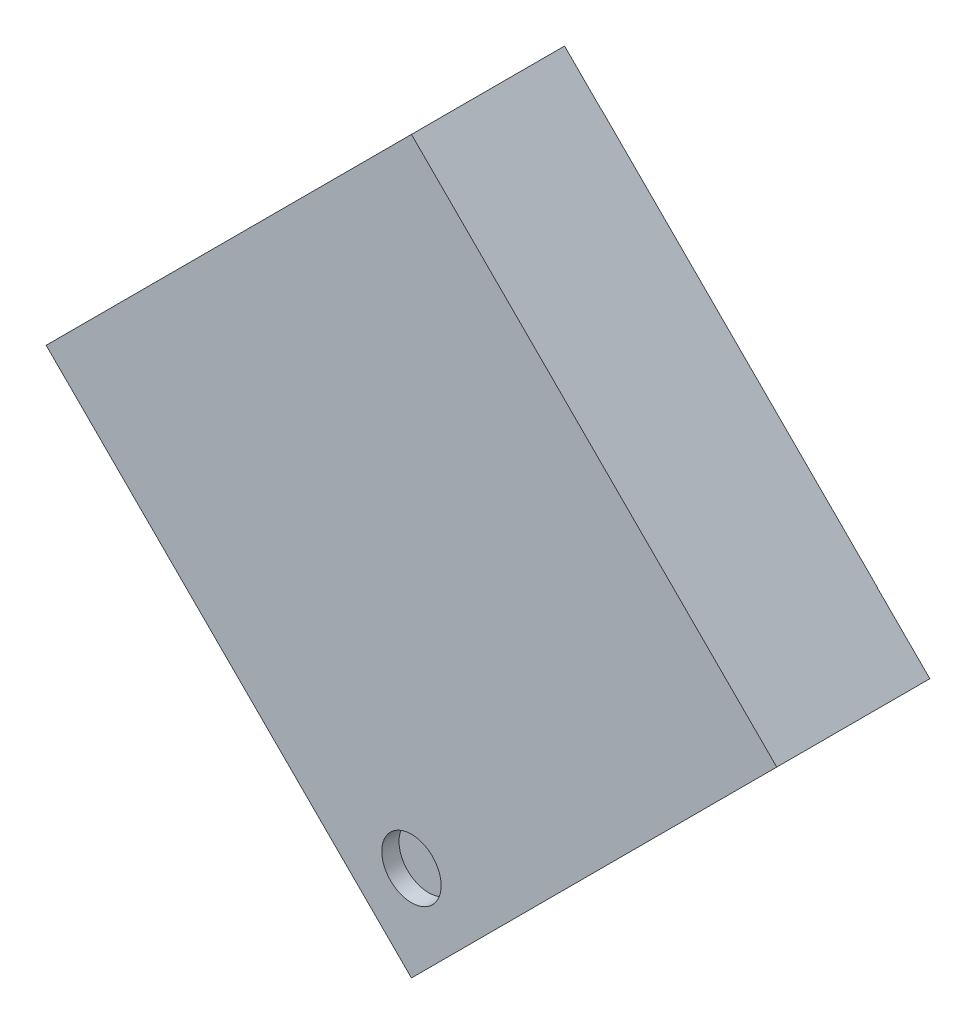
ISO-10303-21;
HEADER;
FILE_DESCRIPTION(('STEP AP214'),'2;1');
FILE_NAME('part.step','',(''),(''),'','','');
FILE_SCHEMA(('AUTOMOTIVE_DESIGN { 1 0 10303 214 1 1 1 1 }'));
ENDSEC;
DATA;
#1=APPLICATION_CONTEXT('core data for automotive mechanical design processes');
#2=APPLICATION_PROTOCOL_DEFINITION('international standard','automotive_design',2000,#1);
#3=PRODUCT_CONTEXT('',#1,'mechanical');
#4=PRODUCT('Part','Part','',(#3));
#5=PRODUCT_RELATED_PRODUCT_CATEGORY('part','',(#4));
#6=PRODUCT_DEFINITION_FORMATION('','',#4);
#7=PRODUCT_DEFINITION_CONTEXT('part definition',#1,'design');
#8=PRODUCT_DEFINITION('design','',#6,#7);
#9=PRODUCT_DEFINITION_SHAPE('','',#8);
#10=(LENGTH_UNIT() NAMED_UNIT(*) SI_UNIT(.MILLI.,.METRE.));
#11=(NAMED_UNIT(*) PLANE_ANGLE_UNIT() SI_UNIT($,.RADIAN.));
#12=(NAMED_UNIT(*) SI_UNIT($,.STERADIAN.) SOLID_ANGLE_UNIT());
#13=UNCERTAINTY_MEASURE_WITH_UNIT(LENGTH_MEASURE(1.E-05),#10,'distance_accuracy_value','');
#14=(GEOMETRIC_REPRESENTATION_CONTEXT(3) GLOBAL_UNCERTAINTY_ASSIGNED_CONTEXT((#13)) GLOBAL_UNIT_ASSIGNED_CONTEXT((#10,
#11,#12)) REPRESENTATION_CONTEXT('',''));
#15=CARTESIAN_POINT('',(0.,0.,0.));
#16=DIRECTION('',(0.,0.,1.));
#17=DIRECTION('',(1.,0.,0.));
#18=AXIS2_PLACEMENT_3D('',#15,#16,#17);
#19=CARTESIAN_POINT('',(0.000121919998491649,4.06399994972162E-05,0.0121919997036457));
#20=DIRECTION('',(0.,-4.37113882867379E-08,0.999999999999999));
#21=DIRECTION('',(1.,0.,0.));
#22=AXIS2_PLACEMENT_3D('',#19,#20,#21);
#23=PLANE('',#22);
#24=DIRECTION('',(1.,0.,0.));
#25=VECTOR('',#24,1.);
#26=CARTESIAN_POINT('',(-1.81619842356115,-0.304959360000502,0.0121919863716723));
#27=LINE('',#26,#25);
#28=CARTESIAN_POINT('',(-1.81619842356115,-0.304959360000502,0.0121919863716723));
#29=VERTEX_POINT('',#28);
#30=CARTESIAN_POINT('',(1.81644226355813,-0.304959360000502,0.0121919863716723));
#31=VERTEX_POINT('',#30);
#32=EDGE_CURVE('E9',#29,#31,#27,.T.);
#33=ORIENTED_EDGE('',*,*,#32,.T.);
#34=DIRECTION('',(0.707106781186548,0.707106781186547,3.09086190726306E-08));
#35=VECTOR('',#34,1.);
#36=CARTESIAN_POINT('',(0.215121919998492,-1.90627970356014,0.012191916375737));
#37=LINE('',#36,#35);
#38=CARTESIAN_POINT('',(0.215121919998492,-1.90627970356014,0.012191916375737));
#39=VERTEX_POINT('',#38);
#40=EDGE_CURVE('E22',#39,#31,#37,.T.);
#41=ORIENTED_EDGE('',*,*,#40,.F.);
#42=DIRECTION('',(0.,0.999999999999999,4.37113882867379E-08));
#43=VECTOR('',#42,1.);
#44=CARTESIAN_POINT('',(0.215121919998492,-1.90627970356014,0.012191916375737));
#45=LINE('',#44,#43);
#46=CARTESIAN_POINT('',(0.215121919998492,-0.851279703560144,0.0121919624912516));
#47=VERTEX_POINT('',#46);
#48=EDGE_CURVE('E261',#39,#47,#45,.T.);
#49=ORIENTED_EDGE('',*,*,#48,.T.);
#50=DIRECTION('',(-1.,0.,0.));
#51=VECTOR('',#50,1.);
#52=CARTESIAN_POINT('',(0.215121919998492,-0.851279703560144,0.0121919624912516));
#53=LINE('',#52,#51);
#54=CARTESIAN_POINT('',(-0.214878080001508,-0.851279703560144,0.0121919624912516));
#55=VERTEX_POINT('',#54);
#56=EDGE_CURVE('E259',#47,#55,#53,.T.);
#57=ORIENTED_EDGE('',*,*,#56,.T.);
#58=DIRECTION('',(0.,-0.999999999999999,-4.37113882867379E-08));
#59=VECTOR('',#58,1.);
#60=CARTESIAN_POINT('',(-0.214878080001508,-0.851279703560144,0.0121919624912516));
#61=LINE('',#60,#59);
#62=CARTESIAN_POINT('',(-0.214878080001509,-1.90627970356014,0.012191916375737));
#63=VERTEX_POINT('',#62);
#64=EDGE_CURVE('E257',#55,#63,#61,.T.);
#65=ORIENTED_EDGE('',*,*,#64,.T.);
#66=DIRECTION('',(0.707106781186547,-0.707106781186547,-3.09086190726306E-08));
#67=VECTOR('',#66,1.);
#68=CARTESIAN_POINT('',(-1.81619842356115,-0.304959360000502,0.0121919863716723));
#69=LINE('',#68,#67);
#70=EDGE_CURVE('E254',#29,#63,#69,.T.);
#71=ORIENTED_EDGE('',*,*,#70,.F.);
#72=EDGE_LOOP('',(#33,#41,#49,#57,#65,#71));
#73=FACE_BOUND('',#72,.T.);
#74=ADVANCED_FACE('F15',(#73),#23,.F.);
#75=CARTESIAN_POINT('',(0.000121919998491649,4.06399994972162E-05,0.0121919997036457));
#76=DIRECTION('',(0.,-4.37113882867379E-08,0.999999999999999));
#77=DIRECTION('',(1.,0.,0.));
#78=AXIS2_PLACEMENT_3D('',#75,#76,#77);
#79=PLANE('',#78);
#80=DIRECTION('',(-1.,0.,0.));
#81=VECTOR('',#80,1.);
#82=CARTESIAN_POINT('',(1.81644226355813,0.305040639999497,0.0121920130356191));
#83=LINE('',#82,#81);
#84=CARTESIAN_POINT('',(1.81644226355813,0.305040639999497,0.0121920130356191));
#85=VERTEX_POINT('',#84);
#86=CARTESIAN_POINT('',(-1.81619842356115,0.305040639999497,0.0121920130356191));
#87=VERTEX_POINT('',#86);
#88=EDGE_CURVE('E252',#85,#87,#83,.T.);
#89=ORIENTED_EDGE('',*,*,#88,.T.);
#90=DIRECTION('',(-0.707106781186548,-0.707106781186547,-3.09086190726306E-08));
#91=VECTOR('',#90,1.);
#92=CARTESIAN_POINT('',(-0.214878080001508,1.90636098355914,0.0121920830315544));
#93=LINE('',#92,#91);
#94=CARTESIAN_POINT('',(-0.214878080001508,1.90636098355914,0.0121920830315544));
#95=VERTEX_POINT('',#94);
#96=EDGE_CURVE('E249',#95,#87,#93,.T.);
#97=ORIENTED_EDGE('',*,*,#96,.F.);
#98=DIRECTION('',(0.,-0.999999999999999,-4.37113882867379E-08));
#99=VECTOR('',#98,1.);
#100=CARTESIAN_POINT('',(-0.214878080001508,1.90636098355914,0.0121920830315544));
#101=LINE('',#100,#99);
#102=CARTESIAN_POINT('',(-0.214878080001508,0.851360983559138,0.0121920369160398));
#103=VERTEX_POINT('',#102);
#104=EDGE_CURVE('E246',#95,#103,#101,.T.);
#105=ORIENTED_EDGE('',*,*,#104,.T.);
#106=DIRECTION('',(1.,0.,0.));
#107=VECTOR('',#106,1.);
#108=CARTESIAN_POINT('',(-0.214878080001508,0.851360983559138,0.0121920369160398));
#109=LINE('',#108,#107);
#110=CARTESIAN_POINT('',(0.215121919998492,0.851360983559138,0.0121920369160398));
#111=VERTEX_POINT('',#110);
#112=EDGE_CURVE('E243',#103,#111,#109,.T.);
#113=ORIENTED_EDGE('',*,*,#112,.T.);
#114=DIRECTION('',(0.,0.999999999999999,4.37113882867379E-08));
#115=VECTOR('',#114,1.);
#116=CARTESIAN_POINT('',(0.215121919998492,0.851360983559138,0.0121920369160398));
#117=LINE('',#116,#115);
#118=CARTESIAN_POINT('',(0.215121919998492,1.90636098355914,0.0121920830315544));
#119=VERTEX_POINT('',#118);
#120=EDGE_CURVE('E241',#111,#119,#117,.T.);
#121=ORIENTED_EDGE('',*,*,#120,.T.);
#122=DIRECTION('',(-0.707106781186548,0.707106781186547,3.09086190726306E-08));
#123=VECTOR('',#122,1.);
#124=CARTESIAN_POINT('',(1.81644226355813,0.305040639999497,0.0121920130356191));
#125=LINE('',#124,#123);
#126=EDGE_CURVE('E238',#85,#119,#125,.T.);
#127=ORIENTED_EDGE('',*,*,#126,.F.);
#128=EDGE_LOOP('',(#89,#97,#105,#113,#121,#127));
#129=FACE_BOUND('',#128,.T.);
#130=ADVANCED_FACE('F300',(#129),#79,.F.);
#131=CARTESIAN_POINT('',(0.000121919998491871,2.12136098355914,0.0121920924295029));
#132=DIRECTION('',(-0.707106781186548,0.707106781186547,3.09086190726306E-08));
#133=DIRECTION('',(-0.707106781186548,-0.707106781186547,-3.09086190726306E-08));
#134=AXIS2_PLACEMENT_3D('',#131,#132,#133);
#135=PLANE('',#134);
#136=DIRECTION('',(-0.707106781186548,-0.707106781186546,-3.09086190726306E-08));
#137=VECTOR('',#136,1.);
#138=CARTESIAN_POINT('',(-1.81619842356115,0.305040639955786,0.0131920130356191));
#139=LINE('',#138,#137);
#140=CARTESIAN_POINT('',(-1.81619842356115,0.305040639955786,0.0131920130356191));
#141=VERTEX_POINT('',#140);
#142=CARTESIAN_POINT('',(-2.12119842356115,4.0639955786383E-05,0.0131919997036457));
#143=VERTEX_POINT('',#142);
#144=EDGE_CURVE('E236',#141,#143,#139,.T.);
#145=ORIENTED_EDGE('',*,*,#144,.T.);
#146=DIRECTION('',(0.,-4.37113887862758E-08,0.999999999999999));
#147=VECTOR('',#146,1.);
#148=CARTESIAN_POINT('',(-2.12119842356115,4.06399557867161E-05,0.0131919997036457));
#149=LINE('',#148,#147);
#150=CARTESIAN_POINT('',(-2.12119842356115,4.0601096361863E-05,0.902191999703645));
#151=VERTEX_POINT('',#150);
#152=EDGE_CURVE('E234',#143,#151,#149,.T.);
#153=ORIENTED_EDGE('',*,*,#152,.T.);
#154=DIRECTION('',(-0.707106781186547,-0.707106781186547,-3.09086190726306E-08));
#155=VECTOR('',#154,1.);
#156=CARTESIAN_POINT('',(0.000121919998491871,2.121360944656,0.902192092429502));
#157=LINE('',#156,#155);
#158=CARTESIAN_POINT('',(0.000121919998491871,2.121360944656,0.902192092429502));
#159=VERTEX_POINT('',#158);
#160=EDGE_CURVE('E231',#159,#151,#157,.T.);
#161=ORIENTED_EDGE('',*,*,#160,.F.);
#162=DIRECTION('',(0.,-4.37113882867379E-08,0.999999999999999));
#163=VECTOR('',#162,1.);
#164=CARTESIAN_POINT('',(0.000121919998492537,2.12136098351542,0.0131920924295029));
#165=LINE('',#164,#163);
#166=CARTESIAN_POINT('',(0.000121919998492204,2.12136098351542,0.0131920924295029));
#167=VERTEX_POINT('',#166);
#168=EDGE_CURVE('E228',#167,#159,#165,.T.);
#169=ORIENTED_EDGE('',*,*,#168,.F.);
#170=DIRECTION('',(-0.707106781186548,-0.707106781186547,-3.09086190726306E-08));
#171=VECTOR('',#170,1.);
#172=CARTESIAN_POINT('',(0.000121919998491007,2.12136098351542,0.0131920924295029));
#173=LINE('',#172,#171);
#174=CARTESIAN_POINT('',(-0.214878080001508,1.90636098351542,0.0131920830315544));
#175=VERTEX_POINT('',#174);
#176=EDGE_CURVE('E226',#167,#175,#173,.T.);
#177=ORIENTED_EDGE('',*,*,#176,.T.);
#178=DIRECTION('',(0.,-4.37113882867379E-08,0.999999999999999));
#179=VECTOR('',#178,1.);
#180=CARTESIAN_POINT('',(-0.214878080001508,1.90636098355914,0.0121920830315544));
#181=LINE('',#180,#179);
#182=EDGE_CURVE('E223',#95,#175,#181,.T.);
#183=ORIENTED_EDGE('',*,*,#182,.F.);
#184=ORIENTED_EDGE('',*,*,#96,.T.);
#185=DIRECTION('',(0.,4.37113882867379E-08,-0.999999999999999));
#186=VECTOR('',#185,1.);
#187=CARTESIAN_POINT('',(-1.81619842356115,0.305040639955786,0.0131920130356191));
#188=LINE('',#187,#186);
#189=EDGE_CURVE('E220',#141,#87,#188,.T.);
#190=ORIENTED_EDGE('',*,*,#189,.F.);
#191=EDGE_LOOP('',(#145,#153,#161,#169,#177,#183,#184,#190));
#192=FACE_BOUND('',#191,.T.);
#193=ADVANCED_FACE('F279',(#192),#135,.T.);
#194=CARTESIAN_POINT('',(2.12144226355813,4.06399994969942E-05,0.0121919997036457));
#195=DIRECTION('',(0.707106781186548,0.707106781186547,3.09086190726306E-08));
#196=DIRECTION('',(-0.707106781186548,0.707106781186547,3.09086190726306E-08));
#197=AXIS2_PLACEMENT_3D('',#194,#195,#196);
#198=PLANE('',#197);
#199=DIRECTION('',(-0.707106781186547,0.707106781186547,3.09086190726306E-08));
#200=VECTOR('',#199,1.);
#201=CARTESIAN_POINT('',(2.12144226355813,4.06399557863909E-05,0.0131919997036457));
#202=LINE('',#201,#200);
#203=CARTESIAN_POINT('',(2.12144226355813,4.06399557852728E-05,0.0131919997036457));
#204=VERTEX_POINT('',#203);
#205=CARTESIAN_POINT('',(1.81644226355813,0.305040639955786,0.0131920130356191));
#206=VERTEX_POINT('',#205);
#207=EDGE_CURVE('E218',#204,#206,#202,.T.);
#208=ORIENTED_EDGE('',*,*,#207,.T.);
#209=DIRECTION('',(0.,-4.37113882867379E-08,0.999999999999999));
#210=VECTOR('',#209,1.);
#211=CARTESIAN_POINT('',(1.81644226355813,0.305040639999497,0.0121920130356191));
#212=LINE('',#211,#210);
#213=EDGE_CURVE('E215',#85,#206,#212,.T.);
#214=ORIENTED_EDGE('',*,*,#213,.F.);
#215=ORIENTED_EDGE('',*,*,#126,.T.);
#216=DIRECTION('',(0.,4.37113882867379E-08,-0.999999999999999));
#217=VECTOR('',#216,1.);
#218=CARTESIAN_POINT('',(0.215121919998492,1.90636098351542,0.0131920830315544));
#219=LINE('',#218,#217);
#220=CARTESIAN_POINT('',(0.215121919998492,1.90636098351542,0.0131920830315544));
#221=VERTEX_POINT('',#220);
#222=EDGE_CURVE('E212',#221,#119,#219,.T.);
#223=ORIENTED_EDGE('',*,*,#222,.F.);
#224=DIRECTION('',(-0.707106781186547,0.707106781186547,3.09086190726306E-08));
#225=VECTOR('',#224,1.);
#226=CARTESIAN_POINT('',(0.215121919998492,1.90636098351542,0.0131920830315544));
#227=LINE('',#226,#225);
#228=EDGE_CURVE('E209',#221,#167,#227,.T.);
#229=ORIENTED_EDGE('',*,*,#228,.T.);
#230=ORIENTED_EDGE('',*,*,#168,.T.);
#231=DIRECTION('',(-0.707106781186548,0.707106781186546,3.09086190726306E-08));
#232=VECTOR('',#231,1.);
#233=CARTESIAN_POINT('',(2.12144226355813,4.0601096361419E-05,0.902191999703645));
#234=LINE('',#233,#232);
#235=CARTESIAN_POINT('',(2.12144226355813,4.0601096361419E-05,0.902191999703645));
#236=VERTEX_POINT('',#235);
#237=EDGE_CURVE('E206',#236,#159,#234,.T.);
#238=ORIENTED_EDGE('',*,*,#237,.F.);
#239=DIRECTION('',(0.,-4.37113877872E-08,0.999999999999999));
#240=VECTOR('',#239,1.);
#241=CARTESIAN_POINT('',(2.12144226355813,4.06399557849397E-05,0.0131919997036457));
#242=LINE('',#241,#240);
#243=EDGE_CURVE('E203',#204,#236,#242,.T.);
#244=ORIENTED_EDGE('',*,*,#243,.F.);
#245=EDGE_LOOP('',(#208,#214,#215,#223,#229,#230,#238,#244));
#246=FACE_BOUND('',#245,.T.);
#247=ADVANCED_FACE('F286',(#246),#198,.T.);
#248=CARTESIAN_POINT('',(0.000121919998491427,-2.12127970356014,0.0121919069777885));
#249=DIRECTION('',(0.707106781186548,-0.707106781186547,-3.09086190726306E-08));
#250=DIRECTION('',(0.707106781186548,0.707106781186547,3.09086190726306E-08));
#251=AXIS2_PLACEMENT_3D('',#248,#249,#250);
#252=PLANE('',#251);
#253=DIRECTION('',(0.707106781186548,0.707106781186546,3.09086190726306E-08));
#254=VECTOR('',#253,1.);
#255=CARTESIAN_POINT('',(1.81644226355813,-0.304959360044214,0.0131919863716723));
#256=LINE('',#255,#254);
#257=CARTESIAN_POINT('',(1.81644226355813,-0.304959360044214,0.0131919863716723));
#258=VERTEX_POINT('',#257);
#259=EDGE_CURVE('E201',#258,#204,#256,.T.);
#260=ORIENTED_EDGE('',*,*,#259,.T.);
#261=ORIENTED_EDGE('',*,*,#243,.T.);
#262=DIRECTION('',(0.707106781186547,0.707106781186547,3.09086190726306E-08));
#263=VECTOR('',#262,1.);
#264=CARTESIAN_POINT('',(0.000121919998491427,-2.12127974246328,0.902191906977788));
#265=LINE('',#264,#263);
#266=CARTESIAN_POINT('',(0.000121919998491427,-2.12127974246328,0.902191906977788));
#267=VERTEX_POINT('',#266);
#268=EDGE_CURVE('E199',#267,#236,#265,.T.);
#269=ORIENTED_EDGE('',*,*,#268,.F.);
#270=DIRECTION('',(0.,-4.37113882867379E-08,0.999999999999999));
#271=VECTOR('',#270,1.);
#272=CARTESIAN_POINT('',(0.00012191999849076,-2.12127970360385,0.0131919069777885));
#273=LINE('',#272,#271);
#274=CARTESIAN_POINT('',(0.000121919998491093,-2.12127970360385,0.0131919069777885));
#275=VERTEX_POINT('',#274);
#276=EDGE_CURVE('E196',#275,#267,#273,.T.);
#277=ORIENTED_EDGE('',*,*,#276,.F.);
#278=DIRECTION('',(0.707106781186547,0.707106781186547,3.09086190726306E-08));
#279=VECTOR('',#278,1.);
#280=CARTESIAN_POINT('',(0.00012191999849229,-2.12127970360385,0.0131919069777885));
#281=LINE('',#280,#279);
#282=CARTESIAN_POINT('',(0.215121919998492,-1.90627970360385,0.013191916375737));
#283=VERTEX_POINT('',#282);
#284=EDGE_CURVE('E193',#275,#283,#281,.T.);
#285=ORIENTED_EDGE('',*,*,#284,.T.);
#286=DIRECTION('',(0.,-4.37113882867379E-08,0.999999999999999));
#287=VECTOR('',#286,1.);
#288=CARTESIAN_POINT('',(0.215121919998492,-1.90627970356014,0.012191916375737));
#289=LINE('',#288,#287);
#290=EDGE_CURVE('E190',#39,#283,#289,.T.);
#291=ORIENTED_EDGE('',*,*,#290,.F.);
#292=ORIENTED_EDGE('',*,*,#40,.T.);
#293=DIRECTION('',(0.,4.37113882867379E-08,-0.999999999999999));
#294=VECTOR('',#293,1.);
#295=CARTESIAN_POINT('',(1.81644226355813,-0.304959360044214,0.0131919863716723));
#296=LINE('',#295,#294);
#297=EDGE_CURVE('E188',#258,#31,#296,.T.);
#298=ORIENTED_EDGE('',*,*,#297,.F.);
#299=EDGE_LOOP('',(#260,#261,#269,#277,#285,#291,#292,#298));
#300=FACE_BOUND('',#299,.T.);
#301=ADVANCED_FACE('F265',(#300),#252,.T.);
#302=CARTESIAN_POINT('',(-2.12119842356115,4.06399994974382E-05,0.0121919997036457));
#303=DIRECTION('',(-0.707106781186548,-0.707106781186547,-3.09086190726306E-08));
#304=DIRECTION('',(0.707106781186548,-0.707106781186547,-3.09086190726306E-08));
#305=AXIS2_PLACEMENT_3D('',#302,#303,#304);
#306=PLANE('',#305);
#307=DIRECTION('',(0.707106781186547,-0.707106781186547,-3.09086190726306E-08));
#308=VECTOR('',#307,1.);
#309=CARTESIAN_POINT('',(-2.12119842356115,4.063995578605E-05,0.0131919997036457));
#310=LINE('',#309,#308);
#311=CARTESIAN_POINT('',(-1.81619842356115,-0.304959360044214,0.0131919863716723));
#312=VERTEX_POINT('',#311);
#313=EDGE_CURVE('E185',#143,#312,#310,.T.);
#314=ORIENTED_EDGE('',*,*,#313,.T.);
#315=DIRECTION('',(0.,-4.37113882867379E-08,0.999999999999999));
#316=VECTOR('',#315,1.);
#317=CARTESIAN_POINT('',(-1.81619842356115,-0.304959360000502,0.0121919863716723));
#318=LINE('',#317,#316);
#319=EDGE_CURVE('E183',#29,#312,#318,.T.);
#320=ORIENTED_EDGE('',*,*,#319,.F.);
#321=ORIENTED_EDGE('',*,*,#70,.T.);
#322=DIRECTION('',(0.,4.37113882867379E-08,-0.999999999999999));
#323=VECTOR('',#322,1.);
#324=CARTESIAN_POINT('',(-0.214878080001509,-1.90627970360385,0.013191916375737));
#325=LINE('',#324,#323);
#326=CARTESIAN_POINT('',(-0.214878080001508,-1.90627970360385,0.013191916375737));
#327=VERTEX_POINT('',#326);
#328=EDGE_CURVE('E180',#327,#63,#325,.T.);
#329=ORIENTED_EDGE('',*,*,#328,.F.);
#330=DIRECTION('',(0.707106781186547,-0.707106781186547,-3.09086190726306E-08));
#331=VECTOR('',#330,1.);
#332=CARTESIAN_POINT('',(-0.214878080001508,-1.90627970360385,0.013191916375737));
#333=LINE('',#332,#331);
#334=EDGE_CURVE('E177',#327,#275,#333,.T.);
#335=ORIENTED_EDGE('',*,*,#334,.T.);
#336=ORIENTED_EDGE('',*,*,#276,.T.);
#337=DIRECTION('',(0.707106781186548,-0.707106781186546,-3.09086190726306E-08));
#338=VECTOR('',#337,1.);
#339=CARTESIAN_POINT('',(-2.12119842356115,4.0601096361863E-05,0.902191999703645));
#340=LINE('',#339,#338);
#341=EDGE_CURVE('E174',#151,#267,#340,.T.);
#342=ORIENTED_EDGE('',*,*,#341,.F.);
#343=ORIENTED_EDGE('',*,*,#152,.F.);
#344=EDGE_LOOP('',(#314,#320,#321,#329,#335,#336,#342,#343));
#345=FACE_BOUND('',#344,.T.);
#346=ADVANCED_FACE('F276',(#345),#306,.T.);
#347=CARTESIAN_POINT('',(0.000121919998491649,4.06399557858279E-05,0.0131919997036457));
#348=DIRECTION('',(0.,4.37113882867379E-08,-0.999999999999999));
#349=DIRECTION('',(1.,0.,0.));
#350=AXIS2_PLACEMENT_3D('',#347,#348,#349);
#351=PLANE('',#350);
#352=ORIENTED_EDGE('',*,*,#334,.F.);
#353=DIRECTION('',(0.,0.999999999999999,4.37113882867379E-08));
#354=VECTOR('',#353,1.);
#355=CARTESIAN_POINT('',(-0.214878080001508,-1.90627970360385,0.013191916375737));
#356=LINE('',#355,#354);
#357=CARTESIAN_POINT('',(-0.214878080001508,-0.851279703603855,0.0131919624912516));
#358=VERTEX_POINT('',#357);
#359=EDGE_CURVE('E171',#327,#358,#356,.T.);
#360=ORIENTED_EDGE('',*,*,#359,.T.);
#361=DIRECTION('',(1.,0.,0.));
#362=VECTOR('',#361,1.);
#363=CARTESIAN_POINT('',(-0.214878080001508,-0.851279703603855,0.0131919624912516));
#364=LINE('',#363,#362);
#365=CARTESIAN_POINT('',(0.215121919998492,-0.851279703603855,0.0131919624912516));
#366=VERTEX_POINT('',#365);
#367=EDGE_CURVE('E168',#358,#366,#364,.T.);
#368=ORIENTED_EDGE('',*,*,#367,.T.);
#369=DIRECTION('',(0.,-0.999999999999999,-4.37113882867379E-08));
#370=VECTOR('',#369,1.);
#371=CARTESIAN_POINT('',(0.215121919998492,-0.851279703603855,0.0131919624912516));
#372=LINE('',#371,#370);
#373=EDGE_CURVE('E166',#366,#283,#372,.T.);
#374=ORIENTED_EDGE('',*,*,#373,.T.);
#375=ORIENTED_EDGE('',*,*,#284,.F.);
#376=EDGE_LOOP('',(#352,#360,#368,#374,#375));
#377=FACE_BOUND('',#376,.T.);
#378=ADVANCED_FACE('F335',(#377),#351,.T.);
#379=CARTESIAN_POINT('',(-0.214878080001508,-0.851279703603855,0.0131919624912516));
#380=DIRECTION('',(0.,0.999999999999999,4.37113882867379E-08));
#381=DIRECTION('',(1.,0.,0.));
#382=AXIS2_PLACEMENT_3D('',#379,#380,#381);
#383=PLANE('',#382);
#384=ORIENTED_EDGE('',*,*,#56,.F.);
#385=DIRECTION('',(0.,4.37113882867379E-08,-0.999999999999999));
#386=VECTOR('',#385,1.);
#387=CARTESIAN_POINT('',(0.215121919998492,-0.851279703603855,0.0131919624912516));
#388=LINE('',#387,#386);
#389=EDGE_CURVE('E163',#366,#47,#388,.T.);
#390=ORIENTED_EDGE('',*,*,#389,.F.);
#391=ORIENTED_EDGE('',*,*,#367,.F.);
#392=DIRECTION('',(0.,4.37113882867379E-08,-0.999999999999999));
#393=VECTOR('',#392,1.);
#394=CARTESIAN_POINT('',(-0.214878080001508,-0.851279703603855,0.0131919624912516));
#395=LINE('',#394,#393);
#396=EDGE_CURVE('E160',#358,#55,#395,.T.);
#397=ORIENTED_EDGE('',*,*,#396,.T.);
#398=EDGE_LOOP('',(#384,#390,#391,#397));
#399=FACE_BOUND('',#398,.T.);
#400=ADVANCED_FACE('F338',(#399),#383,.F.);
#401=CARTESIAN_POINT('',(-0.214878080001508,-1.90627970360385,0.013191916375737));
#402=DIRECTION('',(-1.,0.,0.));
#403=DIRECTION('',(0.,0.999999999999999,4.37113882867379E-08));
#404=AXIS2_PLACEMENT_3D('',#401,#402,#403);
#405=PLANE('',#404);
#406=ORIENTED_EDGE('',*,*,#64,.F.);
#407=ORIENTED_EDGE('',*,*,#396,.F.);
#408=ORIENTED_EDGE('',*,*,#359,.F.);
#409=ORIENTED_EDGE('',*,*,#328,.T.);
#410=EDGE_LOOP('',(#406,#407,#408,#409));
#411=FACE_BOUND('',#410,.T.);
#412=ADVANCED_FACE('F342',(#411),#405,.F.);
#413=CARTESIAN_POINT('',(0.215121919998492,-0.851279703603855,0.0131919624912516));
#414=DIRECTION('',(1.,0.,0.));
#415=DIRECTION('',(0.,-0.999999999999999,-4.37113882867379E-08));
#416=AXIS2_PLACEMENT_3D('',#413,#414,#415);
#417=PLANE('',#416);
#418=ORIENTED_EDGE('',*,*,#48,.F.);
#419=ORIENTED_EDGE('',*,*,#290,.T.);
#420=ORIENTED_EDGE('',*,*,#373,.F.);
#421=ORIENTED_EDGE('',*,*,#389,.T.);
#422=EDGE_LOOP('',(#418,#419,#420,#421));
#423=FACE_BOUND('',#422,.T.);
#424=ADVANCED_FACE('F346',(#423),#417,.F.);
#425=CARTESIAN_POINT('',(0.000121919998491649,4.06399557858279E-05,0.0131919997036457));
#426=DIRECTION('',(0.,4.37113882867379E-08,-0.999999999999999));
#427=DIRECTION('',(1.,0.,0.));
#428=AXIS2_PLACEMENT_3D('',#425,#426,#427);
#429=PLANE('',#428);
#430=ORIENTED_EDGE('',*,*,#228,.F.);
#431=DIRECTION('',(0.,-0.999999999999999,-4.37113882867379E-08));
#432=VECTOR('',#431,1.);
#433=CARTESIAN_POINT('',(0.215121919998492,1.90636098351542,0.0131920830315544));
#434=LINE('',#433,#432);
#435=CARTESIAN_POINT('',(0.215121919998492,0.851360983515427,0.0131920369160398));
#436=VERTEX_POINT('',#435);
#437=EDGE_CURVE('E157',#221,#436,#434,.T.);
#438=ORIENTED_EDGE('',*,*,#437,.T.);
#439=DIRECTION('',(-1.,0.,0.));
#440=VECTOR('',#439,1.);
#441=CARTESIAN_POINT('',(0.215121919998492,0.851360983515427,0.0131920369160398));
#442=LINE('',#441,#440);
#443=CARTESIAN_POINT('',(-0.214878080001508,0.851360983515427,0.0131920369160398));
#444=VERTEX_POINT('',#443);
#445=EDGE_CURVE('E154',#436,#444,#442,.T.);
#446=ORIENTED_EDGE('',*,*,#445,.T.);
#447=DIRECTION('',(0.,0.999999999999999,4.37113882867379E-08));
#448=VECTOR('',#447,1.);
#449=CARTESIAN_POINT('',(-0.214878080001508,0.851360983515427,0.0131920369160398));
#450=LINE('',#449,#448);
#451=EDGE_CURVE('E151',#444,#175,#450,.T.);
#452=ORIENTED_EDGE('',*,*,#451,.T.);
#453=ORIENTED_EDGE('',*,*,#176,.F.);
#454=EDGE_LOOP('',(#430,#438,#446,#452,#453));
#455=FACE_BOUND('',#454,.T.);
#456=ADVANCED_FACE('F292',(#455),#429,.T.);
#457=CARTESIAN_POINT('',(0.215121919998492,1.90636098351542,0.0131920830315544));
#458=DIRECTION('',(1.,0.,0.));
#459=DIRECTION('',(0.,-0.999999999999999,-4.37113882867379E-08));
#460=AXIS2_PLACEMENT_3D('',#457,#458,#459);
#461=PLANE('',#460);
#462=ORIENTED_EDGE('',*,*,#120,.F.);
#463=DIRECTION('',(0.,4.37113882867379E-08,-0.999999999999999));
#464=VECTOR('',#463,1.);
#465=CARTESIAN_POINT('',(0.215121919998492,0.851360983515427,0.0131920369160398));
#466=LINE('',#465,#464);
#467=EDGE_CURVE('E149',#436,#111,#466,.T.);
#468=ORIENTED_EDGE('',*,*,#467,.F.);
#469=ORIENTED_EDGE('',*,*,#437,.F.);
#470=ORIENTED_EDGE('',*,*,#222,.T.);
#471=EDGE_LOOP('',(#462,#468,#469,#470));
#472=FACE_BOUND('',#471,.T.);
#473=ADVANCED_FACE('F308',(#472),#461,.F.);
#474=CARTESIAN_POINT('',(-0.214878080001508,0.851360983515427,0.0131920369160398));
#475=DIRECTION('',(-1.,0.,0.));
#476=DIRECTION('',(0.,0.999999999999999,4.37113882867379E-08));
#477=AXIS2_PLACEMENT_3D('',#474,#475,#476);
#478=PLANE('',#477);
#479=ORIENTED_EDGE('',*,*,#104,.F.);
#480=ORIENTED_EDGE('',*,*,#182,.T.);
#481=ORIENTED_EDGE('',*,*,#451,.F.);
#482=DIRECTION('',(0.,4.37113882867379E-08,-0.999999999999999));
#483=VECTOR('',#482,1.);
#484=CARTESIAN_POINT('',(-0.214878080001508,0.851360983515427,0.0131920369160398));
#485=LINE('',#484,#483);
#486=EDGE_CURVE('E147',#444,#103,#485,.T.);
#487=ORIENTED_EDGE('',*,*,#486,.T.);
#488=EDGE_LOOP('',(#479,#480,#481,#487));
#489=FACE_BOUND('',#488,.T.);
#490=ADVANCED_FACE('F297',(#489),#478,.F.);
#491=CARTESIAN_POINT('',(0.215121919998492,0.851360983515427,0.0131920369160398));
#492=DIRECTION('',(0.,-0.999999999999999,-4.37113882867379E-08));
#493=DIRECTION('',(-1.,0.,0.));
#494=AXIS2_PLACEMENT_3D('',#491,#492,#493);
#495=PLANE('',#494);
#496=ORIENTED_EDGE('',*,*,#112,.F.);
#497=ORIENTED_EDGE('',*,*,#486,.F.);
#498=ORIENTED_EDGE('',*,*,#445,.F.);
#499=ORIENTED_EDGE('',*,*,#467,.T.);
#500=EDGE_LOOP('',(#496,#497,#498,#499));
#501=FACE_BOUND('',#500,.T.);
#502=ADVANCED_FACE('F310',(#501),#495,.F.);
#503=CARTESIAN_POINT('',(0.000121919998491649,4.06399557858279E-05,0.0131919997036457));
#504=DIRECTION('',(0.,4.37113882867379E-08,-0.999999999999999));
#505=DIRECTION('',(1.,0.,0.));
#506=AXIS2_PLACEMENT_3D('',#503,#504,#505);
#507=PLANE('',#506);
#508=ORIENTED_EDGE('',*,*,#313,.F.);
#509=ORIENTED_EDGE('',*,*,#144,.F.);
#510=DIRECTION('',(1.,0.,0.));
#511=VECTOR('',#510,1.);
#512=CARTESIAN_POINT('',(-1.81619842356115,0.305040639955786,0.0131920130356191));
#513=LINE('',#512,#511);
#514=EDGE_CURVE('E144',#141,#206,#513,.T.);
#515=ORIENTED_EDGE('',*,*,#514,.T.);
#516=ORIENTED_EDGE('',*,*,#207,.F.);
#517=ORIENTED_EDGE('',*,*,#259,.F.);
#518=DIRECTION('',(-1.,0.,0.));
#519=VECTOR('',#518,1.);
#520=CARTESIAN_POINT('',(1.81644226355813,-0.304959360044214,0.0131919863716723));
#521=LINE('',#520,#519);
#522=EDGE_CURVE('E142',#258,#312,#521,.T.);
#523=ORIENTED_EDGE('',*,*,#522,.T.);
#524=EDGE_LOOP('',(#508,#509,#515,#516,#517,#523));
#525=FACE_BOUND('',#524,.T.);
#526=ADVANCED_FACE('F272',(#525),#507,.T.);
#527=CARTESIAN_POINT('',(-1.81619842356115,0.305040639955786,0.0131920130356191));
#528=DIRECTION('',(0.,0.999999999999999,4.37113882867379E-08));
#529=DIRECTION('',(1.,0.,0.));
#530=AXIS2_PLACEMENT_3D('',#527,#528,#529);
#531=PLANE('',#530);
#532=ORIENTED_EDGE('',*,*,#88,.F.);
#533=ORIENTED_EDGE('',*,*,#213,.T.);
#534=ORIENTED_EDGE('',*,*,#514,.F.);
#535=ORIENTED_EDGE('',*,*,#189,.T.);
#536=EDGE_LOOP('',(#532,#533,#534,#535));
#537=FACE_BOUND('',#536,.T.);
#538=ADVANCED_FACE('F305',(#537),#531,.F.);
#539=CARTESIAN_POINT('',(1.81644226355813,-0.304959360044214,0.0131919863716723));
#540=DIRECTION('',(0.,-0.999999999999999,-4.37113882867379E-08));
#541=DIRECTION('',(-1.,0.,0.));
#542=AXIS2_PLACEMENT_3D('',#539,#540,#541);
#543=PLANE('',#542);
#544=ORIENTED_EDGE('',*,*,#32,.F.);
#545=ORIENTED_EDGE('',*,*,#319,.T.);
#546=ORIENTED_EDGE('',*,*,#522,.F.);
#547=ORIENTED_EDGE('',*,*,#297,.T.);
#548=EDGE_LOOP('',(#544,#545,#546,#547));
#549=FACE_BOUND('',#548,.T.);
#550=ADVANCED_FACE('F268',(#549),#543,.F.);
#551=CARTESIAN_POINT('',(0.000121919998491649,4.0601096361641E-05,0.902191999703645));
#552=DIRECTION('',(0.,-4.37113882867379E-08,0.999999999999999));
#553=DIRECTION('',(1.,0.,0.));
#554=AXIS2_PLACEMENT_3D('',#551,#552,#553);
#555=PLANE('',#554);
#556=CARTESIAN_POINT('',(0.000121919998491205,-1.57034169109447,0.902191931060055));
#557=DIRECTION('',(0.,-4.37113882867379E-08,0.999999999999999));
#558=DIRECTION('',(1.,0.,0.));
#559=AXIS2_PLACEMENT_3D('',#556,#557,#558);
#560=CIRCLE('',#559,0.172343179297117);
#561=CARTESIAN_POINT('',(0.172465099295609,-1.57034169109447,0.902191931060055));
#562=VERTEX_POINT('',#561);
#563=EDGE_CURVE('E135',#562,#562,#560,.T.);
#564=ORIENTED_EDGE('',*,*,#563,.F.);
#565=EDGE_LOOP('',(#564));
#566=FACE_BOUND('',#565,.T.);
#567=ORIENTED_EDGE('',*,*,#341,.T.);
#568=ORIENTED_EDGE('',*,*,#268,.T.);
#569=ORIENTED_EDGE('',*,*,#237,.T.);
#570=ORIENTED_EDGE('',*,*,#160,.T.);
#571=EDGE_LOOP('',(#567,#568,#569,#570));
#572=FACE_BOUND('',#571,.T.);
#573=ADVANCED_FACE('F282',(#566,#572),#555,.T.);
#574=CARTESIAN_POINT('',(0.000121919998491205,-1.57034168672333,0.802191931060055));
#575=DIRECTION('',(0.,-4.37113882867379E-08,0.999999999999999));
#576=DIRECTION('',(1.,0.,0.));
#577=AXIS2_PLACEMENT_3D('',#574,#575,#576);
#578=CYLINDRICAL_SURFACE('',#577,0.172343179297117);
#579=ORIENTED_EDGE('',*,*,#563,.T.);
#580=DIRECTION('',(0.,-4.37113882867379E-08,0.999999999999999));
#581=VECTOR('',#580,1.);
#582=CARTESIAN_POINT('',(0.172465099295609,-1.57034168672333,0.802191931060055));
#583=LINE('',#582,#581);
#584=CARTESIAN_POINT('',(0.172465099295609,-1.57034168672333,0.802191931060055));
#585=VERTEX_POINT('',#584);
#586=EDGE_CURVE('E130',#585,#562,#583,.T.);
#587=ORIENTED_EDGE('',*,*,#586,.F.);
#588=CARTESIAN_POINT('',(0.000121919998491205,-1.57034168672333,0.802191931060055));
#589=DIRECTION('',(0.,-4.37113882867379E-08,0.999999999999999));
#590=DIRECTION('',(1.,0.,0.));
#591=AXIS2_PLACEMENT_3D('',#588,#589,#590);
#592=CIRCLE('',#591,0.172343179297117);
#593=EDGE_CURVE('E133',#585,#585,#592,.T.);
#594=ORIENTED_EDGE('',*,*,#593,.F.);
#595=ORIENTED_EDGE('',*,*,#586,.T.);
#596=EDGE_LOOP('',(#579,#587,#594,#595));
#597=FACE_BOUND('',#596,.T.);
#598=ADVANCED_FACE('F132',(#597),#578,.F.);
#599=CARTESIAN_POINT('',(0.000121919998491649,4.06054675004697E-05,0.802191999703645));
#600=DIRECTION('',(0.,-4.37113882867379E-08,0.999999999999999));
#601=DIRECTION('',(1.,0.,0.));
#602=AXIS2_PLACEMENT_3D('',#599,#600,#601);
#603=PLANE('',#602);
#604=ORIENTED_EDGE('',*,*,#593,.T.);
#605=EDGE_LOOP('',(#604));
#606=FACE_BOUND('',#605,.T.);
#607=ADVANCED_FACE('F138',(#606),#603,.T.);
#608=CLOSED_SHELL('',(#74,#130,#193,#247,#301,#346,#378,#400,#412,#424,#456,#473,#490,#502,#526,
#538,#550,#573,#598,#607));
#609=MANIFOLD_SOLID_BREP('B1',#608);
#610=ADVANCED_BREP_SHAPE_REPRESENTATION('',(#18,#609),#14);
#611=SHAPE_DEFINITION_REPRESENTATION(#9,#610);
ENDSEC;
END-ISO-10303-21;
